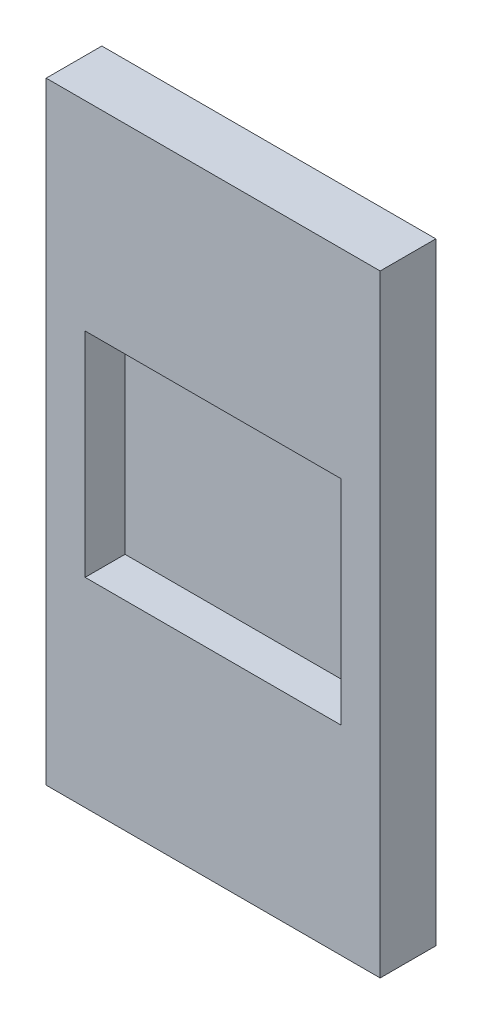
ISO-10303-21;
HEADER;
FILE_DESCRIPTION(('STEP AP214'),'2;1');
FILE_NAME('part.step','',(''),(''),'','','');
FILE_SCHEMA(('AUTOMOTIVE_DESIGN { 1 0 10303 214 1 1 1 1 }'));
ENDSEC;
DATA;
#1=APPLICATION_CONTEXT('core data for automotive mechanical design processes');
#2=APPLICATION_PROTOCOL_DEFINITION('international standard','automotive_design',2000,#1);
#3=PRODUCT_CONTEXT('',#1,'mechanical');
#4=PRODUCT('Part','Part','',(#3));
#5=PRODUCT_RELATED_PRODUCT_CATEGORY('part','',(#4));
#6=PRODUCT_DEFINITION_FORMATION('','',#4);
#7=PRODUCT_DEFINITION_CONTEXT('part definition',#1,'design');
#8=PRODUCT_DEFINITION('design','',#6,#7);
#9=PRODUCT_DEFINITION_SHAPE('','',#8);
#10=(LENGTH_UNIT() NAMED_UNIT(*) SI_UNIT(.MILLI.,.METRE.));
#11=(NAMED_UNIT(*) PLANE_ANGLE_UNIT() SI_UNIT($,.RADIAN.));
#12=(NAMED_UNIT(*) SI_UNIT($,.STERADIAN.) SOLID_ANGLE_UNIT());
#13=UNCERTAINTY_MEASURE_WITH_UNIT(LENGTH_MEASURE(1.E-05),#10,'distance_accuracy_value','');
#14=(GEOMETRIC_REPRESENTATION_CONTEXT(3) GLOBAL_UNCERTAINTY_ASSIGNED_CONTEXT((#13)) GLOBAL_UNIT_ASSIGNED_CONTEXT((#10,
#11,#12)) REPRESENTATION_CONTEXT('',''));
#15=CARTESIAN_POINT('',(0.,0.,0.));
#16=DIRECTION('',(0.,0.,1.));
#17=DIRECTION('',(1.,0.,0.));
#18=AXIS2_PLACEMENT_3D('',#15,#16,#17);
#19=CARTESIAN_POINT('',(9.,-16.5,3.));
#20=DIRECTION('',(-1.,0.,0.));
#21=DIRECTION('',(0.,0.,1.));
#22=AXIS2_PLACEMENT_3D('',#19,#20,#21);
#23=PLANE('',#22);
#24=DIRECTION('',(0.,1.,0.));
#25=VECTOR('',#24,1.);
#26=CARTESIAN_POINT('',(9.,-16.5,0.));
#27=LINE('',#26,#25);
#28=CARTESIAN_POINT('',(9.,-16.5,0.));
#29=VERTEX_POINT('',#28);
#30=CARTESIAN_POINT('',(9.,16.5,0.));
#31=VERTEX_POINT('',#30);
#32=EDGE_CURVE('E158',#29,#31,#27,.T.);
#33=ORIENTED_EDGE('',*,*,#32,.T.);
#34=DIRECTION('',(0.,0.,-1.));
#35=VECTOR('',#34,1.);
#36=CARTESIAN_POINT('',(9.,16.5,3.));
#37=LINE('',#36,#35);
#38=CARTESIAN_POINT('',(9.,16.5,3.));
#39=VERTEX_POINT('',#38);
#40=EDGE_CURVE('E11',#39,#31,#37,.T.);
#41=ORIENTED_EDGE('',*,*,#40,.F.);
#42=DIRECTION('',(0.,1.,0.));
#43=VECTOR('',#42,1.);
#44=CARTESIAN_POINT('',(9.,-16.5,3.));
#45=LINE('',#44,#43);
#46=CARTESIAN_POINT('',(9.,-16.5,3.));
#47=VERTEX_POINT('',#46);
#48=EDGE_CURVE('E164',#47,#39,#45,.T.);
#49=ORIENTED_EDGE('',*,*,#48,.F.);
#50=DIRECTION('',(0.,0.,-1.));
#51=VECTOR('',#50,1.);
#52=CARTESIAN_POINT('',(9.,-16.5,3.));
#53=LINE('',#52,#51);
#54=EDGE_CURVE('E174',#47,#29,#53,.T.);
#55=ORIENTED_EDGE('',*,*,#54,.T.);
#56=EDGE_LOOP('',(#33,#41,#49,#55));
#57=FACE_BOUND('',#56,.T.);
#58=ADVANCED_FACE('F39',(#57),#23,.F.);
#59=CARTESIAN_POINT('',(-9.,16.5,3.));
#60=DIRECTION('',(0.,-1.,0.));
#61=DIRECTION('',(0.,0.,-1.));
#62=AXIS2_PLACEMENT_3D('',#59,#60,#61);
#63=PLANE('',#62);
#64=DIRECTION('',(-1.,0.,0.));
#65=VECTOR('',#64,1.);
#66=CARTESIAN_POINT('',(-9.,16.5,0.));
#67=LINE('',#66,#65);
#68=CARTESIAN_POINT('',(-9.,16.5,0.));
#69=VERTEX_POINT('',#68);
#70=EDGE_CURVE('E178',#31,#69,#67,.T.);
#71=ORIENTED_EDGE('',*,*,#70,.T.);
#72=DIRECTION('',(0.,0.,-1.));
#73=VECTOR('',#72,1.);
#74=CARTESIAN_POINT('',(-9.,16.5,3.));
#75=LINE('',#74,#73);
#76=CARTESIAN_POINT('',(-9.,16.5,3.));
#77=VERTEX_POINT('',#76);
#78=EDGE_CURVE('E47',#77,#69,#75,.T.);
#79=ORIENTED_EDGE('',*,*,#78,.F.);
#80=DIRECTION('',(-1.,0.,0.));
#81=VECTOR('',#80,1.);
#82=CARTESIAN_POINT('',(-9.,16.5,3.));
#83=LINE('',#82,#81);
#84=EDGE_CURVE('E91',#39,#77,#83,.T.);
#85=ORIENTED_EDGE('',*,*,#84,.F.);
#86=ORIENTED_EDGE('',*,*,#40,.T.);
#87=EDGE_LOOP('',(#71,#79,#85,#86));
#88=FACE_BOUND('',#87,.T.);
#89=ADVANCED_FACE('F213',(#88),#63,.F.);
#90=CARTESIAN_POINT('',(-9.,-16.5,3.));
#91=DIRECTION('',(1.,0.,0.));
#92=DIRECTION('',(0.,0.,-1.));
#93=AXIS2_PLACEMENT_3D('',#90,#91,#92);
#94=PLANE('',#93);
#95=DIRECTION('',(0.,-1.,0.));
#96=VECTOR('',#95,1.);
#97=CARTESIAN_POINT('',(-9.,-16.5,0.));
#98=LINE('',#97,#96);
#99=CARTESIAN_POINT('',(-9.,-16.5,0.));
#100=VERTEX_POINT('',#99);
#101=EDGE_CURVE('E181',#69,#100,#98,.T.);
#102=ORIENTED_EDGE('',*,*,#101,.T.);
#103=DIRECTION('',(0.,0.,-1.));
#104=VECTOR('',#103,1.);
#105=CARTESIAN_POINT('',(-9.,-16.5,3.));
#106=LINE('',#105,#104);
#107=CARTESIAN_POINT('',(-9.,-16.5,3.));
#108=VERTEX_POINT('',#107);
#109=EDGE_CURVE('E188',#108,#100,#106,.T.);
#110=ORIENTED_EDGE('',*,*,#109,.F.);
#111=DIRECTION('',(0.,-1.,0.));
#112=VECTOR('',#111,1.);
#113=CARTESIAN_POINT('',(-9.,-16.5,3.));
#114=LINE('',#113,#112);
#115=EDGE_CURVE('E169',#77,#108,#114,.T.);
#116=ORIENTED_EDGE('',*,*,#115,.F.);
#117=ORIENTED_EDGE('',*,*,#78,.T.);
#118=EDGE_LOOP('',(#102,#110,#116,#117));
#119=FACE_BOUND('',#118,.T.);
#120=ADVANCED_FACE('F195',(#119),#94,.F.);
#121=CARTESIAN_POINT('',(-9.,-16.5,3.));
#122=DIRECTION('',(0.,1.,0.));
#123=DIRECTION('',(0.,0.,1.));
#124=AXIS2_PLACEMENT_3D('',#121,#122,#123);
#125=PLANE('',#124);
#126=DIRECTION('',(1.,0.,0.));
#127=VECTOR('',#126,1.);
#128=CARTESIAN_POINT('',(-9.,-16.5,0.));
#129=LINE('',#128,#127);
#130=EDGE_CURVE('E84',#100,#29,#129,.T.);
#131=ORIENTED_EDGE('',*,*,#130,.T.);
#132=ORIENTED_EDGE('',*,*,#54,.F.);
#133=DIRECTION('',(1.,0.,0.));
#134=VECTOR('',#133,1.);
#135=CARTESIAN_POINT('',(-9.,-16.5,3.));
#136=LINE('',#135,#134);
#137=EDGE_CURVE('E63',#108,#47,#136,.T.);
#138=ORIENTED_EDGE('',*,*,#137,.F.);
#139=ORIENTED_EDGE('',*,*,#109,.T.);
#140=EDGE_LOOP('',(#131,#132,#138,#139));
#141=FACE_BOUND('',#140,.T.);
#142=ADVANCED_FACE('F203',(#141),#125,.F.);
#143=CARTESIAN_POINT('',(0.,0.,3.));
#144=DIRECTION('',(0.,0.,-1.));
#145=DIRECTION('',(-1.,0.,0.));
#146=AXIS2_PLACEMENT_3D('',#143,#144,#145);
#147=PLANE('',#146);
#148=DIRECTION('',(-1.,0.,0.));
#149=VECTOR('',#148,1.);
#150=CARTESIAN_POINT('',(-6.9,5.75,3.));
#151=LINE('',#150,#149);
#152=CARTESIAN_POINT('',(6.9,5.75,3.));
#153=VERTEX_POINT('',#152);
#154=CARTESIAN_POINT('',(-6.9,5.75,3.));
#155=VERTEX_POINT('',#154);
#156=EDGE_CURVE('E149',#153,#155,#151,.T.);
#157=ORIENTED_EDGE('',*,*,#156,.F.);
#158=DIRECTION('',(0.,1.,0.));
#159=VECTOR('',#158,1.);
#160=CARTESIAN_POINT('',(6.9,-5.75,3.));
#161=LINE('',#160,#159);
#162=CARTESIAN_POINT('',(6.9,-5.75,3.));
#163=VERTEX_POINT('',#162);
#164=EDGE_CURVE('E54',#163,#153,#161,.T.);
#165=ORIENTED_EDGE('',*,*,#164,.F.);
#166=DIRECTION('',(1.,0.,0.));
#167=VECTOR('',#166,1.);
#168=CARTESIAN_POINT('',(-6.9,-5.75,3.));
#169=LINE('',#168,#167);
#170=CARTESIAN_POINT('',(-6.9,-5.75,3.));
#171=VERTEX_POINT('',#170);
#172=EDGE_CURVE('E136',#171,#163,#169,.T.);
#173=ORIENTED_EDGE('',*,*,#172,.F.);
#174=DIRECTION('',(0.,-1.,0.));
#175=VECTOR('',#174,1.);
#176=CARTESIAN_POINT('',(-6.9,-5.75,3.));
#177=LINE('',#176,#175);
#178=EDGE_CURVE('E140',#155,#171,#177,.T.);
#179=ORIENTED_EDGE('',*,*,#178,.F.);
#180=EDGE_LOOP('',(#157,#165,#173,#179));
#181=FACE_BOUND('',#180,.T.);
#182=ORIENTED_EDGE('',*,*,#48,.T.);
#183=ORIENTED_EDGE('',*,*,#84,.T.);
#184=ORIENTED_EDGE('',*,*,#115,.T.);
#185=ORIENTED_EDGE('',*,*,#137,.T.);
#186=EDGE_LOOP('',(#182,#183,#184,#185));
#187=FACE_BOUND('',#186,.T.);
#188=ADVANCED_FACE('F205',(#181,#187),#147,.F.);
#189=CARTESIAN_POINT('',(0.,0.,0.));
#190=DIRECTION('',(0.,0.,-1.));
#191=DIRECTION('',(-1.,0.,0.));
#192=AXIS2_PLACEMENT_3D('',#189,#190,#191);
#193=PLANE('',#192);
#194=ORIENTED_EDGE('',*,*,#32,.F.);
#195=ORIENTED_EDGE('',*,*,#130,.F.);
#196=ORIENTED_EDGE('',*,*,#101,.F.);
#197=ORIENTED_EDGE('',*,*,#70,.F.);
#198=EDGE_LOOP('',(#194,#195,#196,#197));
#199=FACE_BOUND('',#198,.T.);
#200=ADVANCED_FACE('F199',(#199),#193,.T.);
#201=CARTESIAN_POINT('',(6.9,-5.75,0.85));
#202=DIRECTION('',(1.,0.,0.));
#203=DIRECTION('',(0.,0.,-1.));
#204=AXIS2_PLACEMENT_3D('',#201,#202,#203);
#205=PLANE('',#204);
#206=ORIENTED_EDGE('',*,*,#164,.T.);
#207=DIRECTION('',(0.,0.,1.));
#208=VECTOR('',#207,1.);
#209=CARTESIAN_POINT('',(6.9,5.75,0.85));
#210=LINE('',#209,#208);
#211=CARTESIAN_POINT('',(6.9,5.75,0.85));
#212=VERTEX_POINT('',#211);
#213=EDGE_CURVE('E111',#212,#153,#210,.T.);
#214=ORIENTED_EDGE('',*,*,#213,.F.);
#215=DIRECTION('',(0.,1.,0.));
#216=VECTOR('',#215,1.);
#217=CARTESIAN_POINT('',(6.9,-5.75,0.85));
#218=LINE('',#217,#216);
#219=CARTESIAN_POINT('',(6.9,-5.75,0.85));
#220=VERTEX_POINT('',#219);
#221=EDGE_CURVE('E115',#220,#212,#218,.T.);
#222=ORIENTED_EDGE('',*,*,#221,.F.);
#223=DIRECTION('',(0.,0.,1.));
#224=VECTOR('',#223,1.);
#225=CARTESIAN_POINT('',(6.9,-5.75,0.85));
#226=LINE('',#225,#224);
#227=EDGE_CURVE('E155',#220,#163,#226,.T.);
#228=ORIENTED_EDGE('',*,*,#227,.T.);
#229=EDGE_LOOP('',(#206,#214,#222,#228));
#230=FACE_BOUND('',#229,.T.);
#231=ADVANCED_FACE('F113',(#230),#205,.F.);
#232=CARTESIAN_POINT('',(-6.9,-5.75,0.85));
#233=DIRECTION('',(0.,-1.,0.));
#234=DIRECTION('',(0.,0.,-1.));
#235=AXIS2_PLACEMENT_3D('',#232,#233,#234);
#236=PLANE('',#235);
#237=ORIENTED_EDGE('',*,*,#172,.T.);
#238=ORIENTED_EDGE('',*,*,#227,.F.);
#239=DIRECTION('',(1.,0.,0.));
#240=VECTOR('',#239,1.);
#241=CARTESIAN_POINT('',(-6.9,-5.75,0.85));
#242=LINE('',#241,#240);
#243=CARTESIAN_POINT('',(-6.9,-5.75,0.85));
#244=VERTEX_POINT('',#243);
#245=EDGE_CURVE('E122',#244,#220,#242,.T.);
#246=ORIENTED_EDGE('',*,*,#245,.F.);
#247=DIRECTION('',(0.,0.,1.));
#248=VECTOR('',#247,1.);
#249=CARTESIAN_POINT('',(-6.9,-5.75,0.85));
#250=LINE('',#249,#248);
#251=EDGE_CURVE('E159',#244,#171,#250,.T.);
#252=ORIENTED_EDGE('',*,*,#251,.T.);
#253=EDGE_LOOP('',(#237,#238,#246,#252));
#254=FACE_BOUND('',#253,.T.);
#255=ADVANCED_FACE('F252',(#254),#236,.F.);
#256=CARTESIAN_POINT('',(-6.9,-5.75,0.85));
#257=DIRECTION('',(-1.,0.,0.));
#258=DIRECTION('',(0.,0.,1.));
#259=AXIS2_PLACEMENT_3D('',#256,#257,#258);
#260=PLANE('',#259);
#261=ORIENTED_EDGE('',*,*,#178,.T.);
#262=ORIENTED_EDGE('',*,*,#251,.F.);
#263=DIRECTION('',(0.,-1.,0.));
#264=VECTOR('',#263,1.);
#265=CARTESIAN_POINT('',(-6.9,-5.75,0.85));
#266=LINE('',#265,#264);
#267=CARTESIAN_POINT('',(-6.9,5.75,0.85));
#268=VERTEX_POINT('',#267);
#269=EDGE_CURVE('E131',#268,#244,#266,.T.);
#270=ORIENTED_EDGE('',*,*,#269,.F.);
#271=DIRECTION('',(0.,0.,1.));
#272=VECTOR('',#271,1.);
#273=CARTESIAN_POINT('',(-6.9,5.75,0.85));
#274=LINE('',#273,#272);
#275=EDGE_CURVE('E121',#268,#155,#274,.T.);
#276=ORIENTED_EDGE('',*,*,#275,.T.);
#277=EDGE_LOOP('',(#261,#262,#270,#276));
#278=FACE_BOUND('',#277,.T.);
#279=ADVANCED_FACE('F261',(#278),#260,.F.);
#280=CARTESIAN_POINT('',(-6.9,5.75,0.85));
#281=DIRECTION('',(0.,1.,0.));
#282=DIRECTION('',(0.,0.,1.));
#283=AXIS2_PLACEMENT_3D('',#280,#281,#282);
#284=PLANE('',#283);
#285=ORIENTED_EDGE('',*,*,#156,.T.);
#286=ORIENTED_EDGE('',*,*,#275,.F.);
#287=DIRECTION('',(-1.,0.,0.));
#288=VECTOR('',#287,1.);
#289=CARTESIAN_POINT('',(-6.9,5.75,0.85));
#290=LINE('',#289,#288);
#291=EDGE_CURVE('E125',#212,#268,#290,.T.);
#292=ORIENTED_EDGE('',*,*,#291,.F.);
#293=ORIENTED_EDGE('',*,*,#213,.T.);
#294=EDGE_LOOP('',(#285,#286,#292,#293));
#295=FACE_BOUND('',#294,.T.);
#296=ADVANCED_FACE('F126',(#295),#284,.F.);
#297=CARTESIAN_POINT('',(0.,0.,0.85));
#298=DIRECTION('',(0.,0.,-1.));
#299=DIRECTION('',(-1.,0.,0.));
#300=AXIS2_PLACEMENT_3D('',#297,#298,#299);
#301=PLANE('',#300);
#302=ORIENTED_EDGE('',*,*,#221,.T.);
#303=ORIENTED_EDGE('',*,*,#291,.T.);
#304=ORIENTED_EDGE('',*,*,#269,.T.);
#305=ORIENTED_EDGE('',*,*,#245,.T.);
#306=EDGE_LOOP('',(#302,#303,#304,#305));
#307=FACE_BOUND('',#306,.T.);
#308=ADVANCED_FACE('F133',(#307),#301,.F.);
#309=CLOSED_SHELL('',(#58,#89,#120,#142,#188,#200,#231,#255,#279,#296,#308));
#310=MANIFOLD_SOLID_BREP('B2',#309);
#311=ADVANCED_BREP_SHAPE_REPRESENTATION('',(#18,#310),#14);
#312=SHAPE_DEFINITION_REPRESENTATION(#9,#311);
ENDSEC;
END-ISO-10303-21;
